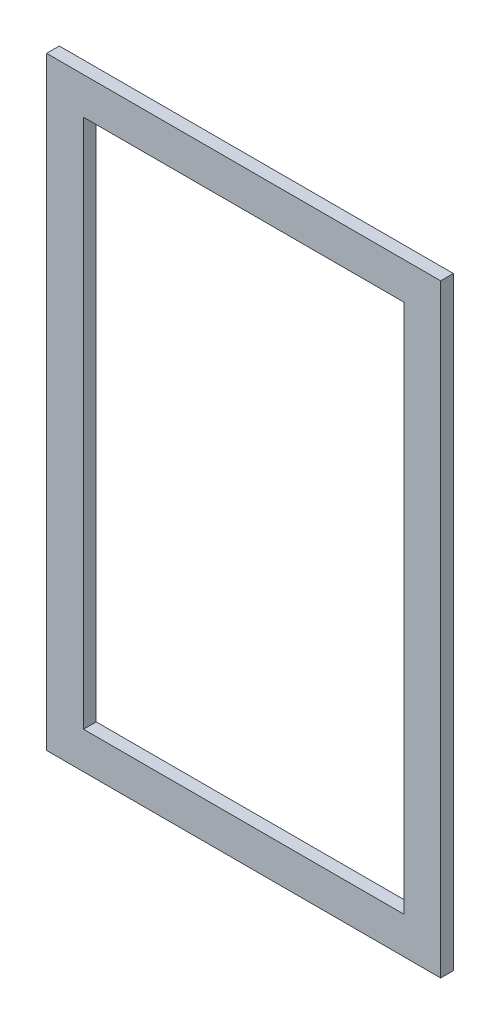
ISO-10303-21;
HEADER;
FILE_DESCRIPTION(('STEP AP214'),'2;1');
FILE_NAME('part.step','',(''),(''),'','','');
FILE_SCHEMA(('AUTOMOTIVE_DESIGN { 1 0 10303 214 1 1 1 1 }'));
ENDSEC;
DATA;
#1=APPLICATION_CONTEXT('core data for automotive mechanical design processes');
#2=APPLICATION_PROTOCOL_DEFINITION('international standard','automotive_design',2000,#1);
#3=PRODUCT_CONTEXT('',#1,'mechanical');
#4=PRODUCT('Part','Part','',(#3));
#5=PRODUCT_RELATED_PRODUCT_CATEGORY('part','',(#4));
#6=PRODUCT_DEFINITION_FORMATION('','',#4);
#7=PRODUCT_DEFINITION_CONTEXT('part definition',#1,'design');
#8=PRODUCT_DEFINITION('design','',#6,#7);
#9=PRODUCT_DEFINITION_SHAPE('','',#8);
#10=(LENGTH_UNIT() NAMED_UNIT(*) SI_UNIT(.MILLI.,.METRE.));
#11=(NAMED_UNIT(*) PLANE_ANGLE_UNIT() SI_UNIT($,.RADIAN.));
#12=(NAMED_UNIT(*) SI_UNIT($,.STERADIAN.) SOLID_ANGLE_UNIT());
#13=UNCERTAINTY_MEASURE_WITH_UNIT(LENGTH_MEASURE(1.E-05),#10,'distance_accuracy_value','');
#14=(GEOMETRIC_REPRESENTATION_CONTEXT(3) GLOBAL_UNCERTAINTY_ASSIGNED_CONTEXT((#13)) GLOBAL_UNIT_ASSIGNED_CONTEXT((#10,
#11,#12)) REPRESENTATION_CONTEXT('',''));
#15=CARTESIAN_POINT('',(0.,0.,0.));
#16=DIRECTION('',(0.,0.,1.));
#17=DIRECTION('',(1.,0.,0.));
#18=AXIS2_PLACEMENT_3D('',#15,#16,#17);
#19=CARTESIAN_POINT('',(0.,0.,1.));
#20=DIRECTION('',(0.,0.,-1.));
#21=DIRECTION('',(-1.,0.,0.));
#22=AXIS2_PLACEMENT_3D('',#19,#20,#21);
#23=PLANE('',#22);
#24=DIRECTION('',(0.,-1.,0.));
#25=VECTOR('',#24,1.);
#26=CARTESIAN_POINT('',(0.,0.,1.));
#27=LINE('',#26,#25);
#28=CARTESIAN_POINT('',(0.,47.5,1.));
#29=VERTEX_POINT('',#28);
#30=CARTESIAN_POINT('',(0.,0.,1.));
#31=VERTEX_POINT('',#30);
#32=EDGE_CURVE('E134',#29,#31,#27,.T.);
#33=ORIENTED_EDGE('',*,*,#32,.T.);
#34=DIRECTION('',(1.,0.,0.));
#35=VECTOR('',#34,1.);
#36=CARTESIAN_POINT('',(0.,0.,1.));
#37=LINE('',#36,#35);
#38=CARTESIAN_POINT('',(31.,0.,1.));
#39=VERTEX_POINT('',#38);
#40=EDGE_CURVE('E137',#31,#39,#37,.T.);
#41=ORIENTED_EDGE('',*,*,#40,.T.);
#42=DIRECTION('',(0.,1.,0.));
#43=VECTOR('',#42,1.);
#44=CARTESIAN_POINT('',(31.,0.,1.));
#45=LINE('',#44,#43);
#46=CARTESIAN_POINT('',(31.,47.5,1.));
#47=VERTEX_POINT('',#46);
#48=EDGE_CURVE('E140',#39,#47,#45,.T.);
#49=ORIENTED_EDGE('',*,*,#48,.T.);
#50=DIRECTION('',(-1.,0.,0.));
#51=VECTOR('',#50,1.);
#52=CARTESIAN_POINT('',(0.,47.5,1.));
#53=LINE('',#52,#51);
#54=EDGE_CURVE('E142',#47,#29,#53,.T.);
#55=ORIENTED_EDGE('',*,*,#54,.T.);
#56=EDGE_LOOP('',(#33,#41,#49,#55));
#57=FACE_BOUND('',#56,.T.);
#58=DIRECTION('',(0.,-1.,0.));
#59=VECTOR('',#58,1.);
#60=CARTESIAN_POINT('',(2.9,2.9,1.));
#61=LINE('',#60,#59);
#62=CARTESIAN_POINT('',(2.9,44.6,1.));
#63=VERTEX_POINT('',#62);
#64=CARTESIAN_POINT('',(2.9,2.9,1.));
#65=VERTEX_POINT('',#64);
#66=EDGE_CURVE('E98',#63,#65,#61,.T.);
#67=ORIENTED_EDGE('',*,*,#66,.F.);
#68=DIRECTION('',(-1.,0.,0.));
#69=VECTOR('',#68,1.);
#70=CARTESIAN_POINT('',(2.9,44.6,1.));
#71=LINE('',#70,#69);
#72=CARTESIAN_POINT('',(28.1,44.6,1.));
#73=VERTEX_POINT('',#72);
#74=EDGE_CURVE('E120',#73,#63,#71,.T.);
#75=ORIENTED_EDGE('',*,*,#74,.F.);
#76=DIRECTION('',(0.,1.,0.));
#77=VECTOR('',#76,1.);
#78=CARTESIAN_POINT('',(28.1,2.9,1.));
#79=LINE('',#78,#77);
#80=CARTESIAN_POINT('',(28.1,2.9,1.));
#81=VERTEX_POINT('',#80);
#82=EDGE_CURVE('E118',#81,#73,#79,.T.);
#83=ORIENTED_EDGE('',*,*,#82,.F.);
#84=DIRECTION('',(1.,0.,0.));
#85=VECTOR('',#84,1.);
#86=CARTESIAN_POINT('',(2.9,2.9,1.));
#87=LINE('',#86,#85);
#88=EDGE_CURVE('E106',#65,#81,#87,.T.);
#89=ORIENTED_EDGE('',*,*,#88,.F.);
#90=EDGE_LOOP('',(#67,#75,#83,#89));
#91=FACE_BOUND('',#90,.T.);
#92=ADVANCED_FACE('F33',(#57,#91),#23,.F.);
#93=CARTESIAN_POINT('',(0.,0.,0.));
#94=DIRECTION('',(0.,0.,-1.));
#95=DIRECTION('',(-1.,0.,0.));
#96=AXIS2_PLACEMENT_3D('',#93,#94,#95);
#97=PLANE('',#96);
#98=DIRECTION('',(0.,-1.,0.));
#99=VECTOR('',#98,1.);
#100=CARTESIAN_POINT('',(0.,0.,0.));
#101=LINE('',#100,#99);
#102=CARTESIAN_POINT('',(0.,47.5,0.));
#103=VERTEX_POINT('',#102);
#104=CARTESIAN_POINT('',(0.,0.,0.));
#105=VERTEX_POINT('',#104);
#106=EDGE_CURVE('E114',#103,#105,#101,.T.);
#107=ORIENTED_EDGE('',*,*,#106,.F.);
#108=DIRECTION('',(-1.,0.,0.));
#109=VECTOR('',#108,1.);
#110=CARTESIAN_POINT('',(0.,47.5,0.));
#111=LINE('',#110,#109);
#112=CARTESIAN_POINT('',(31.,47.5,0.));
#113=VERTEX_POINT('',#112);
#114=EDGE_CURVE('E138',#113,#103,#111,.T.);
#115=ORIENTED_EDGE('',*,*,#114,.F.);
#116=DIRECTION('',(0.,1.,0.));
#117=VECTOR('',#116,1.);
#118=CARTESIAN_POINT('',(31.,0.,0.));
#119=LINE('',#118,#117);
#120=CARTESIAN_POINT('',(31.,0.,0.));
#121=VERTEX_POINT('',#120);
#122=EDGE_CURVE('E149',#121,#113,#119,.T.);
#123=ORIENTED_EDGE('',*,*,#122,.F.);
#124=DIRECTION('',(1.,0.,0.));
#125=VECTOR('',#124,1.);
#126=CARTESIAN_POINT('',(0.,0.,0.));
#127=LINE('',#126,#125);
#128=EDGE_CURVE('E147',#105,#121,#127,.T.);
#129=ORIENTED_EDGE('',*,*,#128,.F.);
#130=EDGE_LOOP('',(#107,#115,#123,#129));
#131=FACE_BOUND('',#130,.T.);
#132=DIRECTION('',(-1.,0.,0.));
#133=VECTOR('',#132,1.);
#134=CARTESIAN_POINT('',(2.9,44.6,0.));
#135=LINE('',#134,#133);
#136=CARTESIAN_POINT('',(28.1,44.6,0.));
#137=VERTEX_POINT('',#136);
#138=CARTESIAN_POINT('',(2.9,44.6,0.));
#139=VERTEX_POINT('',#138);
#140=EDGE_CURVE('E107',#137,#139,#135,.T.);
#141=ORIENTED_EDGE('',*,*,#140,.T.);
#142=DIRECTION('',(0.,-1.,0.));
#143=VECTOR('',#142,1.);
#144=CARTESIAN_POINT('',(2.9,2.9,0.));
#145=LINE('',#144,#143);
#146=CARTESIAN_POINT('',(2.9,2.9,0.));
#147=VERTEX_POINT('',#146);
#148=EDGE_CURVE('E56',#139,#147,#145,.T.);
#149=ORIENTED_EDGE('',*,*,#148,.T.);
#150=DIRECTION('',(1.,0.,0.));
#151=VECTOR('',#150,1.);
#152=CARTESIAN_POINT('',(2.9,2.9,0.));
#153=LINE('',#152,#151);
#154=CARTESIAN_POINT('',(28.1,2.9,0.));
#155=VERTEX_POINT('',#154);
#156=EDGE_CURVE('E113',#147,#155,#153,.T.);
#157=ORIENTED_EDGE('',*,*,#156,.T.);
#158=DIRECTION('',(0.,1.,0.));
#159=VECTOR('',#158,1.);
#160=CARTESIAN_POINT('',(28.1,2.9,0.));
#161=LINE('',#160,#159);
#162=EDGE_CURVE('E126',#155,#137,#161,.T.);
#163=ORIENTED_EDGE('',*,*,#162,.T.);
#164=EDGE_LOOP('',(#141,#149,#157,#163));
#165=FACE_BOUND('',#164,.T.);
#166=ADVANCED_FACE('F167',(#131,#165),#97,.T.);
#167=CARTESIAN_POINT('',(0.,0.,1.));
#168=DIRECTION('',(1.,0.,0.));
#169=DIRECTION('',(0.,1.,0.));
#170=AXIS2_PLACEMENT_3D('',#167,#168,#169);
#171=PLANE('',#170);
#172=ORIENTED_EDGE('',*,*,#106,.T.);
#173=DIRECTION('',(0.,0.,-1.));
#174=VECTOR('',#173,1.);
#175=CARTESIAN_POINT('',(0.,0.,1.));
#176=LINE('',#175,#174);
#177=EDGE_CURVE('E11',#31,#105,#176,.T.);
#178=ORIENTED_EDGE('',*,*,#177,.F.);
#179=ORIENTED_EDGE('',*,*,#32,.F.);
#180=DIRECTION('',(0.,0.,-1.));
#181=VECTOR('',#180,1.);
#182=CARTESIAN_POINT('',(0.,47.5,1.));
#183=LINE('',#182,#181);
#184=EDGE_CURVE('E144',#29,#103,#183,.T.);
#185=ORIENTED_EDGE('',*,*,#184,.T.);
#186=EDGE_LOOP('',(#172,#178,#179,#185));
#187=FACE_BOUND('',#186,.T.);
#188=ADVANCED_FACE('F35',(#187),#171,.F.);
#189=CARTESIAN_POINT('',(0.,0.,1.));
#190=DIRECTION('',(0.,1.,0.));
#191=DIRECTION('',(0.,0.,1.));
#192=AXIS2_PLACEMENT_3D('',#189,#190,#191);
#193=PLANE('',#192);
#194=ORIENTED_EDGE('',*,*,#128,.T.);
#195=DIRECTION('',(0.,0.,-1.));
#196=VECTOR('',#195,1.);
#197=CARTESIAN_POINT('',(31.,0.,1.));
#198=LINE('',#197,#196);
#199=EDGE_CURVE('E41',#39,#121,#198,.T.);
#200=ORIENTED_EDGE('',*,*,#199,.F.);
#201=ORIENTED_EDGE('',*,*,#40,.F.);
#202=ORIENTED_EDGE('',*,*,#177,.T.);
#203=EDGE_LOOP('',(#194,#200,#201,#202));
#204=FACE_BOUND('',#203,.T.);
#205=ADVANCED_FACE('F177',(#204),#193,.F.);
#206=CARTESIAN_POINT('',(31.,0.,1.));
#207=DIRECTION('',(-1.,0.,0.));
#208=DIRECTION('',(0.,-1.,0.));
#209=AXIS2_PLACEMENT_3D('',#206,#207,#208);
#210=PLANE('',#209);
#211=ORIENTED_EDGE('',*,*,#122,.T.);
#212=DIRECTION('',(0.,0.,-1.));
#213=VECTOR('',#212,1.);
#214=CARTESIAN_POINT('',(31.,47.5,1.));
#215=LINE('',#214,#213);
#216=EDGE_CURVE('E154',#47,#113,#215,.T.);
#217=ORIENTED_EDGE('',*,*,#216,.F.);
#218=ORIENTED_EDGE('',*,*,#48,.F.);
#219=ORIENTED_EDGE('',*,*,#199,.T.);
#220=EDGE_LOOP('',(#211,#217,#218,#219));
#221=FACE_BOUND('',#220,.T.);
#222=ADVANCED_FACE('F161',(#221),#210,.F.);
#223=CARTESIAN_POINT('',(0.,47.5,1.));
#224=DIRECTION('',(0.,-1.,0.));
#225=DIRECTION('',(0.,0.,-1.));
#226=AXIS2_PLACEMENT_3D('',#223,#224,#225);
#227=PLANE('',#226);
#228=ORIENTED_EDGE('',*,*,#114,.T.);
#229=ORIENTED_EDGE('',*,*,#184,.F.);
#230=ORIENTED_EDGE('',*,*,#54,.F.);
#231=ORIENTED_EDGE('',*,*,#216,.T.);
#232=EDGE_LOOP('',(#228,#229,#230,#231));
#233=FACE_BOUND('',#232,.T.);
#234=ADVANCED_FACE('F171',(#233),#227,.F.);
#235=CARTESIAN_POINT('',(2.9,2.9,1.));
#236=DIRECTION('',(1.,0.,0.));
#237=DIRECTION('',(0.,0.,-1.));
#238=AXIS2_PLACEMENT_3D('',#235,#236,#237);
#239=PLANE('',#238);
#240=ORIENTED_EDGE('',*,*,#148,.F.);
#241=DIRECTION('',(0.,0.,-1.));
#242=VECTOR('',#241,1.);
#243=CARTESIAN_POINT('',(2.9,44.6,1.));
#244=LINE('',#243,#242);
#245=EDGE_CURVE('E102',#63,#139,#244,.T.);
#246=ORIENTED_EDGE('',*,*,#245,.F.);
#247=ORIENTED_EDGE('',*,*,#66,.T.);
#248=DIRECTION('',(0.,0.,-1.));
#249=VECTOR('',#248,1.);
#250=CARTESIAN_POINT('',(2.9,2.9,1.));
#251=LINE('',#250,#249);
#252=EDGE_CURVE('E101',#65,#147,#251,.T.);
#253=ORIENTED_EDGE('',*,*,#252,.T.);
#254=EDGE_LOOP('',(#240,#246,#247,#253));
#255=FACE_BOUND('',#254,.T.);
#256=ADVANCED_FACE('F100',(#255),#239,.T.);
#257=CARTESIAN_POINT('',(2.9,2.9,1.));
#258=DIRECTION('',(0.,1.,0.));
#259=DIRECTION('',(0.,0.,1.));
#260=AXIS2_PLACEMENT_3D('',#257,#258,#259);
#261=PLANE('',#260);
#262=ORIENTED_EDGE('',*,*,#156,.F.);
#263=ORIENTED_EDGE('',*,*,#252,.F.);
#264=ORIENTED_EDGE('',*,*,#88,.T.);
#265=DIRECTION('',(0.,0.,-1.));
#266=VECTOR('',#265,1.);
#267=CARTESIAN_POINT('',(28.1,2.9,1.));
#268=LINE('',#267,#266);
#269=EDGE_CURVE('E115',#81,#155,#268,.T.);
#270=ORIENTED_EDGE('',*,*,#269,.T.);
#271=EDGE_LOOP('',(#262,#263,#264,#270));
#272=FACE_BOUND('',#271,.T.);
#273=ADVANCED_FACE('F110',(#272),#261,.T.);
#274=CARTESIAN_POINT('',(28.1,2.9,1.));
#275=DIRECTION('',(-1.,0.,0.));
#276=DIRECTION('',(0.,0.,1.));
#277=AXIS2_PLACEMENT_3D('',#274,#275,#276);
#278=PLANE('',#277);
#279=ORIENTED_EDGE('',*,*,#162,.F.);
#280=ORIENTED_EDGE('',*,*,#269,.F.);
#281=ORIENTED_EDGE('',*,*,#82,.T.);
#282=DIRECTION('',(0.,0.,-1.));
#283=VECTOR('',#282,1.);
#284=CARTESIAN_POINT('',(28.1,44.6,1.));
#285=LINE('',#284,#283);
#286=EDGE_CURVE('E48',#73,#137,#285,.T.);
#287=ORIENTED_EDGE('',*,*,#286,.T.);
#288=EDGE_LOOP('',(#279,#280,#281,#287));
#289=FACE_BOUND('',#288,.T.);
#290=ADVANCED_FACE('F200',(#289),#278,.T.);
#291=CARTESIAN_POINT('',(2.9,44.6,1.));
#292=DIRECTION('',(0.,-1.,0.));
#293=DIRECTION('',(0.,0.,-1.));
#294=AXIS2_PLACEMENT_3D('',#291,#292,#293);
#295=PLANE('',#294);
#296=ORIENTED_EDGE('',*,*,#140,.F.);
#297=ORIENTED_EDGE('',*,*,#286,.F.);
#298=ORIENTED_EDGE('',*,*,#74,.T.);
#299=ORIENTED_EDGE('',*,*,#245,.T.);
#300=EDGE_LOOP('',(#296,#297,#298,#299));
#301=FACE_BOUND('',#300,.T.);
#302=ADVANCED_FACE('F204',(#301),#295,.T.);
#303=CLOSED_SHELL('',(#92,#166,#188,#205,#222,#234,#256,#273,#290,#302));
#304=MANIFOLD_SOLID_BREP('B2',#303);
#305=ADVANCED_BREP_SHAPE_REPRESENTATION('',(#18,#304),#14);
#306=SHAPE_DEFINITION_REPRESENTATION(#9,#305);
ENDSEC;
END-ISO-10303-21;
